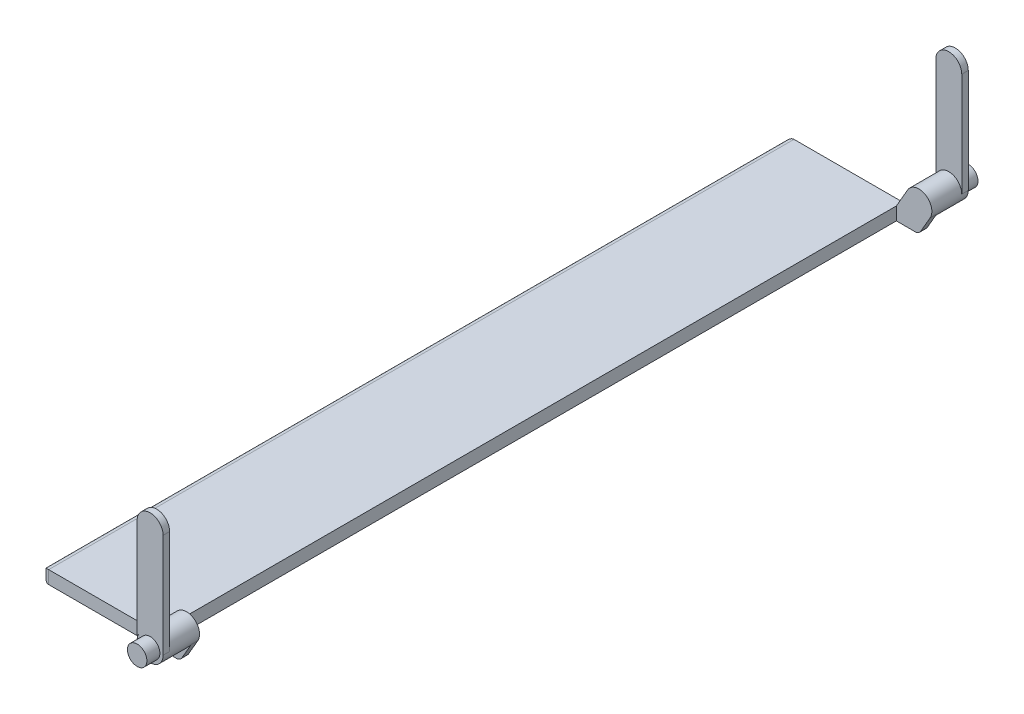
ISO-10303-21;
HEADER;
FILE_DESCRIPTION(('STEP AP214'),'2;1');
FILE_NAME('part.step','',(''),(''),'','','');
FILE_SCHEMA(('AUTOMOTIVE_DESIGN { 1 0 10303 214 1 1 1 1 }'));
ENDSEC;
DATA;
#1=APPLICATION_CONTEXT('core data for automotive mechanical design processes');
#2=APPLICATION_PROTOCOL_DEFINITION('international standard','automotive_design',2000,#1);
#3=PRODUCT_CONTEXT('',#1,'mechanical');
#4=PRODUCT('Part','Part','',(#3));
#5=PRODUCT_RELATED_PRODUCT_CATEGORY('part','',(#4));
#6=PRODUCT_DEFINITION_FORMATION('','',#4);
#7=PRODUCT_DEFINITION_CONTEXT('part definition',#1,'design');
#8=PRODUCT_DEFINITION('design','',#6,#7);
#9=PRODUCT_DEFINITION_SHAPE('','',#8);
#10=(LENGTH_UNIT() NAMED_UNIT(*) SI_UNIT(.MILLI.,.METRE.));
#11=(NAMED_UNIT(*) PLANE_ANGLE_UNIT() SI_UNIT($,.RADIAN.));
#12=(NAMED_UNIT(*) SI_UNIT($,.STERADIAN.) SOLID_ANGLE_UNIT());
#13=UNCERTAINTY_MEASURE_WITH_UNIT(LENGTH_MEASURE(1.E-05),#10,'distance_accuracy_value','');
#14=(GEOMETRIC_REPRESENTATION_CONTEXT(3) GLOBAL_UNCERTAINTY_ASSIGNED_CONTEXT((#13)) GLOBAL_UNIT_ASSIGNED_CONTEXT((#10,
#11,#12)) REPRESENTATION_CONTEXT('',''));
#15=CARTESIAN_POINT('',(0.,0.,0.));
#16=DIRECTION('',(0.,0.,1.));
#17=DIRECTION('',(1.,0.,0.));
#18=AXIS2_PLACEMENT_3D('',#15,#16,#17);
#19=CARTESIAN_POINT('',(0.,0.,91.1098));
#20=DIRECTION('',(0.,0.,-1.));
#21=DIRECTION('',(-1.,0.,0.));
#22=AXIS2_PLACEMENT_3D('',#19,#20,#21);
#23=CYLINDRICAL_SURFACE('',#22,3.175);
#24=DIRECTION('',(0.,0.,-1.));
#25=VECTOR('',#24,1.);
#26=CARTESIAN_POINT('',(-2.7496306570156,1.58749999999999,91.1098));
#27=LINE('',#26,#25);
#28=CARTESIAN_POINT('',(-2.7496306570156,1.5875,-89.5223));
#29=VERTEX_POINT('',#28);
#30=CARTESIAN_POINT('',(-2.7496306570156,1.58749999999999,-91.1098));
#31=VERTEX_POINT('',#30);
#32=EDGE_CURVE('E350',#29,#31,#27,.T.);
#33=ORIENTED_EDGE('',*,*,#32,.F.);
#34=CARTESIAN_POINT('',(0.,0.,-89.5223));
#35=DIRECTION('',(0.,0.,-1.));
#36=DIRECTION('',(-1.,0.,0.));
#37=AXIS2_PLACEMENT_3D('',#34,#35,#36);
#38=CIRCLE('',#37,3.175);
#39=CARTESIAN_POINT('',(2.74963065701558,-1.5875,-89.5223));
#40=VERTEX_POINT('',#39);
#41=EDGE_CURVE('E316',#29,#40,#38,.T.);
#42=ORIENTED_EDGE('',*,*,#41,.T.);
#43=DIRECTION('',(0.,0.,-1.));
#44=VECTOR('',#43,1.);
#45=CARTESIAN_POINT('',(2.74963065701558,-1.5875,91.1098));
#46=LINE('',#45,#44);
#47=CARTESIAN_POINT('',(2.74963065701559,-1.58749999999999,-91.1098));
#48=VERTEX_POINT('',#47);
#49=EDGE_CURVE('E354',#40,#48,#46,.T.);
#50=ORIENTED_EDGE('',*,*,#49,.T.);
#51=CARTESIAN_POINT('',(0.,0.,-91.1098));
#52=DIRECTION('',(0.,0.,1.));
#53=DIRECTION('',(1.,0.,0.));
#54=AXIS2_PLACEMENT_3D('',#51,#52,#53);
#55=CIRCLE('',#54,3.17499999999999);
#56=EDGE_CURVE('E279',#31,#48,#55,.T.);
#57=ORIENTED_EDGE('',*,*,#56,.F.);
#58=EDGE_LOOP('',(#33,#42,#50,#57));
#59=FACE_BOUND('',#58,.T.);
#60=DIRECTION('',(0.,0.,-1.));
#61=VECTOR('',#60,1.);
#62=CARTESIAN_POINT('',(3.17499999999999,0.,-96.8375));
#63=LINE('',#62,#61);
#64=CARTESIAN_POINT('',(3.17499999999999,0.,-96.8375));
#65=VERTEX_POINT('',#64);
#66=CARTESIAN_POINT('',(3.17499999999999,0.,-98.425));
#67=VERTEX_POINT('',#66);
#68=EDGE_CURVE('E58',#65,#67,#63,.T.);
#69=ORIENTED_EDGE('',*,*,#68,.F.);
#70=CARTESIAN_POINT('',(0.,0.,-96.8375));
#71=DIRECTION('',(0.,0.,1.));
#72=DIRECTION('',(-1.,0.,0.));
#73=AXIS2_PLACEMENT_3D('',#70,#71,#72);
#74=CIRCLE('',#73,3.175);
#75=CARTESIAN_POINT('',(-2.7496306570156,1.58749999999999,-96.8375));
#76=VERTEX_POINT('',#75);
#77=EDGE_CURVE('E241',#65,#76,#74,.T.);
#78=ORIENTED_EDGE('',*,*,#77,.T.);
#79=DIRECTION('',(0.,0.,-1.));
#80=VECTOR('',#79,1.);
#81=CARTESIAN_POINT('',(-2.7496306570156,1.58749999999999,-96.8375));
#82=LINE('',#81,#80);
#83=CARTESIAN_POINT('',(-2.7496306570156,1.58749999999999,-98.425));
#84=VERTEX_POINT('',#83);
#85=EDGE_CURVE('E256',#76,#84,#82,.T.);
#86=ORIENTED_EDGE('',*,*,#85,.T.);
#87=CARTESIAN_POINT('',(0.,0.,-98.425));
#88=DIRECTION('',(0.,0.,1.));
#89=DIRECTION('',(1.,0.,0.));
#90=AXIS2_PLACEMENT_3D('',#87,#88,#89);
#91=CIRCLE('',#90,3.17499999999999);
#92=EDGE_CURVE('E280',#84,#67,#91,.T.);
#93=ORIENTED_EDGE('',*,*,#92,.T.);
#94=EDGE_LOOP('',(#69,#78,#86,#93));
#95=FACE_BOUND('',#94,.T.);
#96=ADVANCED_FACE('F35',(#59,#95),#23,.T.);
#97=CARTESIAN_POINT('',(0.,0.,91.1098));
#98=DIRECTION('',(0.,0.,1.));
#99=DIRECTION('',(1.,0.,0.));
#100=AXIS2_PLACEMENT_3D('',#97,#98,#99);
#101=PLANE('',#100);
#102=DIRECTION('',(0.499999999999999,0.866025403784439,0.));
#103=VECTOR('',#102,1.);
#104=CARTESIAN_POINT('',(2.74963065701559,-1.58749999999999,91.1098));
#105=LINE('',#104,#103);
#106=CARTESIAN_POINT('',(0.458271776169257,-5.55625000000001,91.1098));
#107=VERTEX_POINT('',#106);
#108=CARTESIAN_POINT('',(2.74963065701558,-1.5875,91.1098));
#109=VERTEX_POINT('',#108);
#110=EDGE_CURVE('E326',#107,#109,#105,.T.);
#111=ORIENTED_EDGE('',*,*,#110,.T.);
#112=CARTESIAN_POINT('',(0.,0.,91.1098));
#113=DIRECTION('',(0.,0.,1.));
#114=DIRECTION('',(1.,0.,0.));
#115=AXIS2_PLACEMENT_3D('',#112,#113,#114);
#116=CIRCLE('',#115,3.17499999999999);
#117=CARTESIAN_POINT('',(-2.74963065701559,1.58749999999999,91.1098));
#118=VERTEX_POINT('',#117);
#119=EDGE_CURVE('E287',#118,#109,#116,.T.);
#120=ORIENTED_EDGE('',*,*,#119,.F.);
#121=DIRECTION('',(-0.5,-0.866025403784439,0.));
#122=VECTOR('',#121,1.);
#123=CARTESIAN_POINT('',(-2.7496306570156,1.5875,91.1098));
#124=LINE('',#123,#122);
#125=CARTESIAN_POINT('',(-5.49926131402924,-3.17499999999662,91.1098));
#126=VERTEX_POINT('',#125);
#127=EDGE_CURVE('E328',#118,#126,#124,.T.);
#128=ORIENTED_EDGE('',*,*,#127,.T.);
#129=DIRECTION('',(1.,0.,0.));
#130=VECTOR('',#129,1.);
#131=CARTESIAN_POINT('',(0.,-3.17499999999662,91.1098));
#132=LINE('',#131,#130);
#133=CARTESIAN_POINT('',(-32.1183,-3.17499999999663,91.1098));
#134=VERTEX_POINT('',#133);
#135=EDGE_CURVE('E332',#134,#126,#132,.T.);
#136=ORIENTED_EDGE('',*,*,#135,.F.);
#137=DIRECTION('',(0.,1.,0.));
#138=VECTOR('',#137,1.);
#139=CARTESIAN_POINT('',(-32.1183,0.,91.1098));
#140=LINE('',#139,#138);
#141=CARTESIAN_POINT('',(-32.1183,-6.35,91.1098));
#142=VERTEX_POINT('',#141);
#143=EDGE_CURVE('E382',#134,#142,#140,.F.);
#144=ORIENTED_EDGE('',*,*,#143,.T.);
#145=DIRECTION('',(1.,0.,0.));
#146=VECTOR('',#145,1.);
#147=CARTESIAN_POINT('',(0.,-6.35000000000001,91.1098));
#148=LINE('',#147,#146);
#149=CARTESIAN_POINT('',(-0.916543552338539,-6.35000000000001,91.1098));
#150=VERTEX_POINT('',#149);
#151=EDGE_CURVE('E334',#142,#150,#148,.T.);
#152=ORIENTED_EDGE('',*,*,#151,.T.);
#153=CARTESIAN_POINT('',(-0.916543552338539,-4.76250000000001,91.1098));
#154=DIRECTION('',(0.,0.,1.));
#155=DIRECTION('',(1.,0.,0.));
#156=AXIS2_PLACEMENT_3D('',#153,#154,#155);
#157=CIRCLE('',#156,1.5875);
#158=EDGE_CURVE('E385',#150,#107,#157,.T.);
#159=ORIENTED_EDGE('',*,*,#158,.T.);
#160=EDGE_LOOP('',(#111,#120,#128,#136,#144,#152,#159));
#161=FACE_BOUND('',#160,.T.);
#162=ADVANCED_FACE('F442',(#161),#101,.T.);
#163=CARTESIAN_POINT('',(2.74963065701559,-1.58749999999999,91.1098));
#164=DIRECTION('',(-0.866025403784439,0.499999999999999,0.));
#165=DIRECTION('',(-0.499999999999999,-0.866025403784439,0.));
#166=AXIS2_PLACEMENT_3D('',#163,#164,#165);
#167=PLANE('',#166);
#168=ORIENTED_EDGE('',*,*,#110,.F.);
#169=DIRECTION('',(0.,0.,-1.));
#170=VECTOR('',#169,1.);
#171=CARTESIAN_POINT('',(0.458271776169257,-5.55625000000001,91.1098));
#172=LINE('',#171,#170);
#173=CARTESIAN_POINT('',(0.458271776169257,-5.55625000000001,89.5223));
#174=VERTEX_POINT('',#173);
#175=EDGE_CURVE('E377',#107,#174,#172,.T.);
#176=ORIENTED_EDGE('',*,*,#175,.T.);
#177=DIRECTION('',(-0.499999999999999,-0.866025403784439,0.));
#178=VECTOR('',#177,1.);
#179=CARTESIAN_POINT('',(2.74963065701559,-1.58749999999999,89.5223));
#180=LINE('',#179,#178);
#181=CARTESIAN_POINT('',(2.74963065701558,-1.5875,89.5223));
#182=VERTEX_POINT('',#181);
#183=EDGE_CURVE('E310',#182,#174,#180,.T.);
#184=ORIENTED_EDGE('',*,*,#183,.F.);
#185=EDGE_CURVE('E355',#109,#182,#46,.T.);
#186=ORIENTED_EDGE('',*,*,#185,.F.);
#187=EDGE_LOOP('',(#168,#176,#184,#186));
#188=FACE_BOUND('',#187,.T.);
#189=ADVANCED_FACE('F450',(#188),#167,.F.);
#190=CARTESIAN_POINT('',(0.,0.,89.5223));
#191=DIRECTION('',(0.,0.,-1.));
#192=DIRECTION('',(-1.,0.,0.));
#193=AXIS2_PLACEMENT_3D('',#190,#191,#192);
#194=CIRCLE('',#193,3.175);
#195=CARTESIAN_POINT('',(-2.7496306570156,1.5875,89.5223));
#196=VERTEX_POINT('',#195);
#197=EDGE_CURVE('E308',#196,#182,#194,.T.);
#198=ORIENTED_EDGE('',*,*,#197,.F.);
#199=EDGE_CURVE('E351',#118,#196,#27,.T.);
#200=ORIENTED_EDGE('',*,*,#199,.F.);
#201=ORIENTED_EDGE('',*,*,#119,.T.);
#202=ORIENTED_EDGE('',*,*,#185,.T.);
#203=EDGE_LOOP('',(#198,#200,#201,#202));
#204=FACE_BOUND('',#203,.T.);
#205=CARTESIAN_POINT('',(0.,0.,98.425));
#206=DIRECTION('',(0.,0.,1.));
#207=DIRECTION('',(1.,0.,0.));
#208=AXIS2_PLACEMENT_3D('',#205,#206,#207);
#209=CIRCLE('',#208,3.17499999999999);
#210=CARTESIAN_POINT('',(-2.7496306570156,1.5875,98.425));
#211=VERTEX_POINT('',#210);
#212=CARTESIAN_POINT('',(3.17499999999999,0.,98.425));
#213=VERTEX_POINT('',#212);
#214=EDGE_CURVE('E290',#211,#213,#209,.T.);
#215=ORIENTED_EDGE('',*,*,#214,.F.);
#216=DIRECTION('',(0.,0.,1.));
#217=VECTOR('',#216,1.);
#218=CARTESIAN_POINT('',(-2.7496306570156,1.58749999999999,96.8375));
#219=LINE('',#218,#217);
#220=CARTESIAN_POINT('',(-2.7496306570156,1.58749999999999,96.8375));
#221=VERTEX_POINT('',#220);
#222=EDGE_CURVE('E50',#221,#211,#219,.T.);
#223=ORIENTED_EDGE('',*,*,#222,.F.);
#224=CARTESIAN_POINT('',(0.,0.,96.8375));
#225=DIRECTION('',(0.,0.,1.));
#226=DIRECTION('',(-1.,0.,0.));
#227=AXIS2_PLACEMENT_3D('',#224,#225,#226);
#228=CIRCLE('',#227,3.175);
#229=CARTESIAN_POINT('',(3.17499999999999,0.,96.8375));
#230=VERTEX_POINT('',#229);
#231=EDGE_CURVE('E200',#230,#221,#228,.T.);
#232=ORIENTED_EDGE('',*,*,#231,.F.);
#233=DIRECTION('',(0.,0.,1.));
#234=VECTOR('',#233,1.);
#235=CARTESIAN_POINT('',(3.17499999999999,0.,96.8375));
#236=LINE('',#235,#234);
#237=EDGE_CURVE('E208',#230,#213,#236,.T.);
#238=ORIENTED_EDGE('',*,*,#237,.T.);
#239=EDGE_LOOP('',(#215,#223,#232,#238));
#240=FACE_BOUND('',#239,.T.);
#241=ADVANCED_FACE('F218',(#204,#240),#23,.T.);
#242=CARTESIAN_POINT('',(-2.7496306570156,1.5875,91.1098));
#243=DIRECTION('',(0.866025403784439,-0.5,0.));
#244=DIRECTION('',(0.5,0.866025403784439,0.));
#245=AXIS2_PLACEMENT_3D('',#242,#243,#244);
#246=PLANE('',#245);
#247=DIRECTION('',(0.5,0.866025403784439,0.));
#248=VECTOR('',#247,1.);
#249=CARTESIAN_POINT('',(-2.7496306570156,1.5875,89.5223));
#250=LINE('',#249,#248);
#251=CARTESIAN_POINT('',(-5.49926131402924,-3.17499999999662,89.5223));
#252=VERTEX_POINT('',#251);
#253=EDGE_CURVE('E303',#252,#196,#250,.T.);
#254=ORIENTED_EDGE('',*,*,#253,.F.);
#255=DIRECTION('',(0.,0.,-1.));
#256=VECTOR('',#255,1.);
#257=CARTESIAN_POINT('',(-5.49926131402924,-3.17499999999662,91.1098));
#258=LINE('',#257,#256);
#259=EDGE_CURVE('E347',#126,#252,#258,.T.);
#260=ORIENTED_EDGE('',*,*,#259,.F.);
#261=ORIENTED_EDGE('',*,*,#127,.F.);
#262=ORIENTED_EDGE('',*,*,#199,.T.);
#263=EDGE_LOOP('',(#254,#260,#261,#262));
#264=FACE_BOUND('',#263,.T.);
#265=ADVANCED_FACE('F460',(#264),#246,.F.);
#266=DIRECTION('',(-0.499999999999999,-0.866025403784439,0.));
#267=VECTOR('',#266,1.);
#268=CARTESIAN_POINT('',(2.74963065701559,-1.58749999999999,-89.5223));
#269=LINE('',#268,#267);
#270=CARTESIAN_POINT('',(0.458271776169257,-5.55625000000001,-89.5223));
#271=VERTEX_POINT('',#270);
#272=EDGE_CURVE('E319',#40,#271,#269,.T.);
#273=ORIENTED_EDGE('',*,*,#272,.T.);
#274=DIRECTION('',(0.,0.,-1.));
#275=VECTOR('',#274,1.);
#276=CARTESIAN_POINT('',(0.458271776169257,-5.55625000000001,91.1098));
#277=LINE('',#276,#275);
#278=CARTESIAN_POINT('',(0.458271776169257,-5.55625000000001,-91.1098));
#279=VERTEX_POINT('',#278);
#280=EDGE_CURVE('E362',#271,#279,#277,.T.);
#281=ORIENTED_EDGE('',*,*,#280,.T.);
#282=DIRECTION('',(0.499999999999999,0.866025403784439,0.));
#283=VECTOR('',#282,1.);
#284=CARTESIAN_POINT('',(2.74963065701559,-1.58749999999999,-91.1098));
#285=LINE('',#284,#283);
#286=EDGE_CURVE('E325',#279,#48,#285,.T.);
#287=ORIENTED_EDGE('',*,*,#286,.T.);
#288=ORIENTED_EDGE('',*,*,#49,.F.);
#289=EDGE_LOOP('',(#273,#281,#287,#288));
#290=FACE_BOUND('',#289,.T.);
#291=ADVANCED_FACE('F425',(#290),#167,.F.);
#292=CARTESIAN_POINT('',(-5.49926131402924,-3.17499999999662,-89.5223));
#293=VERTEX_POINT('',#292);
#294=CARTESIAN_POINT('',(-5.49926131402924,-3.17499999999662,-91.1098));
#295=VERTEX_POINT('',#294);
#296=EDGE_CURVE('E337',#293,#295,#258,.T.);
#297=ORIENTED_EDGE('',*,*,#296,.F.);
#298=DIRECTION('',(0.5,0.866025403784439,0.));
#299=VECTOR('',#298,1.);
#300=CARTESIAN_POINT('',(-2.7496306570156,1.5875,-89.5223));
#301=LINE('',#300,#299);
#302=EDGE_CURVE('E313',#293,#29,#301,.T.);
#303=ORIENTED_EDGE('',*,*,#302,.T.);
#304=ORIENTED_EDGE('',*,*,#32,.T.);
#305=DIRECTION('',(-0.5,-0.866025403784439,0.));
#306=VECTOR('',#305,1.);
#307=CARTESIAN_POINT('',(-2.7496306570156,1.5875,-91.1098));
#308=LINE('',#307,#306);
#309=EDGE_CURVE('E340',#31,#295,#308,.T.);
#310=ORIENTED_EDGE('',*,*,#309,.T.);
#311=EDGE_LOOP('',(#297,#303,#304,#310));
#312=FACE_BOUND('',#311,.T.);
#313=ADVANCED_FACE('F418',(#312),#246,.F.);
#314=CARTESIAN_POINT('',(0.,-3.17499999999662,91.1098));
#315=DIRECTION('',(0.,1.,0.));
#316=DIRECTION('',(-1.,0.,0.));
#317=AXIS2_PLACEMENT_3D('',#314,#315,#316);
#318=PLANE('',#317);
#319=DIRECTION('',(1.,0.,0.));
#320=VECTOR('',#319,1.);
#321=CARTESIAN_POINT('',(0.,-3.17499999999662,-91.1098));
#322=LINE('',#321,#320);
#323=CARTESIAN_POINT('',(-32.1183,-3.17499999999663,-91.1098));
#324=VERTEX_POINT('',#323);
#325=EDGE_CURVE('E343',#324,#295,#322,.T.);
#326=ORIENTED_EDGE('',*,*,#325,.F.);
#327=DIRECTION('',(0.,0.,-1.));
#328=VECTOR('',#327,1.);
#329=CARTESIAN_POINT('',(-32.1183,-3.17499999999663,91.1098));
#330=LINE('',#329,#328);
#331=EDGE_CURVE('E43',#324,#134,#330,.F.);
#332=ORIENTED_EDGE('',*,*,#331,.T.);
#333=ORIENTED_EDGE('',*,*,#135,.T.);
#334=ORIENTED_EDGE('',*,*,#259,.T.);
#335=DIRECTION('',(0.,0.,-1.));
#336=VECTOR('',#335,1.);
#337=CARTESIAN_POINT('',(-5.49926131402924,-3.17499999999662,91.1098));
#338=LINE('',#337,#336);
#339=EDGE_CURVE('E322',#252,#293,#338,.T.);
#340=ORIENTED_EDGE('',*,*,#339,.T.);
#341=ORIENTED_EDGE('',*,*,#296,.T.);
#342=EDGE_LOOP('',(#326,#332,#333,#334,#340,#341));
#343=FACE_BOUND('',#342,.T.);
#344=ADVANCED_FACE('F413',(#343),#318,.T.);
#345=CARTESIAN_POINT('',(0.,-6.35000000000001,91.1098));
#346=DIRECTION('',(0.,1.,0.));
#347=DIRECTION('',(-1.,0.,0.));
#348=AXIS2_PLACEMENT_3D('',#345,#346,#347);
#349=PLANE('',#348);
#350=DIRECTION('',(1.,0.,0.));
#351=VECTOR('',#350,1.);
#352=CARTESIAN_POINT('',(0.,-6.35000000000001,-91.1098));
#353=LINE('',#352,#351);
#354=CARTESIAN_POINT('',(-32.1183,-6.35,-91.1098));
#355=VERTEX_POINT('',#354);
#356=CARTESIAN_POINT('',(-0.916543552338539,-6.35000000000001,-91.1098));
#357=VERTEX_POINT('',#356);
#358=EDGE_CURVE('E329',#355,#357,#353,.T.);
#359=ORIENTED_EDGE('',*,*,#358,.T.);
#360=DIRECTION('',(0.,0.,-1.));
#361=VECTOR('',#360,1.);
#362=CARTESIAN_POINT('',(-0.916543552338539,-6.35000000000001,91.1098));
#363=LINE('',#362,#361);
#364=CARTESIAN_POINT('',(-0.916543552338539,-6.35000000000001,-89.5223));
#365=VERTEX_POINT('',#364);
#366=EDGE_CURVE('E373',#357,#365,#363,.F.);
#367=ORIENTED_EDGE('',*,*,#366,.T.);
#368=DIRECTION('',(-1.,0.,0.));
#369=VECTOR('',#368,1.);
#370=CARTESIAN_POINT('',(0.,-6.35000000000001,-89.5223));
#371=LINE('',#370,#369);
#372=CARTESIAN_POINT('',(-5.49926131402924,-6.35000000000001,-89.5223));
#373=VERTEX_POINT('',#372);
#374=EDGE_CURVE('E360',#365,#373,#371,.T.);
#375=ORIENTED_EDGE('',*,*,#374,.T.);
#376=DIRECTION('',(0.,0.,-1.));
#377=VECTOR('',#376,1.);
#378=CARTESIAN_POINT('',(-5.49926131402924,-6.35000000000001,0.));
#379=LINE('',#378,#377);
#380=CARTESIAN_POINT('',(-5.49926131402924,-6.35000000000001,89.5223));
#381=VERTEX_POINT('',#380);
#382=EDGE_CURVE('E295',#381,#373,#379,.T.);
#383=ORIENTED_EDGE('',*,*,#382,.F.);
#384=DIRECTION('',(-1.,0.,0.));
#385=VECTOR('',#384,1.);
#386=CARTESIAN_POINT('',(0.,-6.35000000000001,89.5223));
#387=LINE('',#386,#385);
#388=CARTESIAN_POINT('',(-0.916543552338539,-6.35000000000001,89.5223));
#389=VERTEX_POINT('',#388);
#390=EDGE_CURVE('E358',#389,#381,#387,.T.);
#391=ORIENTED_EDGE('',*,*,#390,.F.);
#392=DIRECTION('',(0.,0.,-1.));
#393=VECTOR('',#392,1.);
#394=CARTESIAN_POINT('',(-0.916543552338539,-6.35000000000001,91.1098));
#395=LINE('',#394,#393);
#396=EDGE_CURVE('E371',#389,#150,#395,.F.);
#397=ORIENTED_EDGE('',*,*,#396,.T.);
#398=ORIENTED_EDGE('',*,*,#151,.F.);
#399=DIRECTION('',(0.,0.,-1.));
#400=VECTOR('',#399,1.);
#401=CARTESIAN_POINT('',(-32.1183,-6.35,-91.1098));
#402=LINE('',#401,#400);
#403=EDGE_CURVE('E369',#142,#355,#402,.T.);
#404=ORIENTED_EDGE('',*,*,#403,.T.);
#405=EDGE_LOOP('',(#359,#367,#375,#383,#391,#397,#398,#404));
#406=FACE_BOUND('',#405,.T.);
#407=ADVANCED_FACE('F436',(#406),#349,.F.);
#408=CARTESIAN_POINT('',(0.,0.,-91.1098));
#409=DIRECTION('',(0.,0.,1.));
#410=DIRECTION('',(1.,0.,0.));
#411=AXIS2_PLACEMENT_3D('',#408,#409,#410);
#412=PLANE('',#411);
#413=ORIENTED_EDGE('',*,*,#309,.F.);
#414=ORIENTED_EDGE('',*,*,#56,.T.);
#415=ORIENTED_EDGE('',*,*,#286,.F.);
#416=CARTESIAN_POINT('',(-0.916543552338539,-4.76250000000001,-91.1098));
#417=DIRECTION('',(0.,0.,1.));
#418=DIRECTION('',(1.,0.,0.));
#419=AXIS2_PLACEMENT_3D('',#416,#417,#418);
#420=CIRCLE('',#419,1.5875);
#421=EDGE_CURVE('E367',#279,#357,#420,.F.);
#422=ORIENTED_EDGE('',*,*,#421,.T.);
#423=ORIENTED_EDGE('',*,*,#358,.F.);
#424=DIRECTION('',(0.,1.,0.));
#425=VECTOR('',#424,1.);
#426=CARTESIAN_POINT('',(-32.1183,-3.17499999999663,-91.1098));
#427=LINE('',#426,#425);
#428=EDGE_CURVE('E365',#355,#324,#427,.T.);
#429=ORIENTED_EDGE('',*,*,#428,.T.);
#430=ORIENTED_EDGE('',*,*,#325,.T.);
#431=EDGE_LOOP('',(#413,#414,#415,#422,#423,#429,#430));
#432=FACE_BOUND('',#431,.T.);
#433=ADVANCED_FACE('F410',(#432),#412,.F.);
#434=CARTESIAN_POINT('',(0.,-6.35000000000001,-89.5223));
#435=DIRECTION('',(0.,0.,-1.));
#436=DIRECTION('',(-1.,0.,0.));
#437=AXIS2_PLACEMENT_3D('',#434,#435,#436);
#438=PLANE('',#437);
#439=ORIENTED_EDGE('',*,*,#374,.F.);
#440=CARTESIAN_POINT('',(-0.916543552338539,-4.76250000000001,-89.5223));
#441=DIRECTION('',(0.,0.,-1.));
#442=DIRECTION('',(-1.,0.,0.));
#443=AXIS2_PLACEMENT_3D('',#440,#441,#442);
#444=CIRCLE('',#443,1.5875);
#445=EDGE_CURVE('E375',#365,#271,#444,.F.);
#446=ORIENTED_EDGE('',*,*,#445,.T.);
#447=ORIENTED_EDGE('',*,*,#272,.F.);
#448=ORIENTED_EDGE('',*,*,#41,.F.);
#449=ORIENTED_EDGE('',*,*,#302,.F.);
#450=DIRECTION('',(0.,1.,0.));
#451=VECTOR('',#450,1.);
#452=CARTESIAN_POINT('',(-5.49926131402924,-6.35000000000001,-89.5223));
#453=LINE('',#452,#451);
#454=EDGE_CURVE('E300',#373,#293,#453,.T.);
#455=ORIENTED_EDGE('',*,*,#454,.F.);
#456=EDGE_LOOP('',(#439,#446,#447,#448,#449,#455));
#457=FACE_BOUND('',#456,.T.);
#458=ADVANCED_FACE('F429',(#457),#438,.F.);
#459=CARTESIAN_POINT('',(0.,-6.35000000000001,89.5223));
#460=DIRECTION('',(0.,0.,-1.));
#461=DIRECTION('',(-1.,0.,0.));
#462=AXIS2_PLACEMENT_3D('',#459,#460,#461);
#463=PLANE('',#462);
#464=ORIENTED_EDGE('',*,*,#183,.T.);
#465=CARTESIAN_POINT('',(-0.916543552338539,-4.76250000000001,89.5223));
#466=DIRECTION('',(0.,0.,-1.));
#467=DIRECTION('',(-1.,0.,0.));
#468=AXIS2_PLACEMENT_3D('',#465,#466,#467);
#469=CIRCLE('',#468,1.5875);
#470=EDGE_CURVE('E380',#174,#389,#469,.T.);
#471=ORIENTED_EDGE('',*,*,#470,.T.);
#472=ORIENTED_EDGE('',*,*,#390,.T.);
#473=DIRECTION('',(0.,1.,0.));
#474=VECTOR('',#473,1.);
#475=CARTESIAN_POINT('',(-5.49926131402924,-6.35000000000001,89.5223));
#476=LINE('',#475,#474);
#477=EDGE_CURVE('E298',#381,#252,#476,.T.);
#478=ORIENTED_EDGE('',*,*,#477,.T.);
#479=ORIENTED_EDGE('',*,*,#253,.T.);
#480=ORIENTED_EDGE('',*,*,#197,.T.);
#481=EDGE_LOOP('',(#464,#471,#472,#478,#479,#480));
#482=FACE_BOUND('',#481,.T.);
#483=ADVANCED_FACE('F453',(#482),#463,.T.);
#484=CARTESIAN_POINT('',(-5.49926131402924,-6.35000000000001,0.));
#485=DIRECTION('',(1.,0.,0.));
#486=DIRECTION('',(0.,0.,-1.));
#487=AXIS2_PLACEMENT_3D('',#484,#485,#486);
#488=PLANE('',#487);
#489=ORIENTED_EDGE('',*,*,#477,.F.);
#490=ORIENTED_EDGE('',*,*,#382,.T.);
#491=ORIENTED_EDGE('',*,*,#454,.T.);
#492=ORIENTED_EDGE('',*,*,#339,.F.);
#493=EDGE_LOOP('',(#489,#490,#491,#492));
#494=FACE_BOUND('',#493,.T.);
#495=ADVANCED_FACE('F479',(#494),#488,.T.);
#496=CARTESIAN_POINT('',(-0.916543552338539,-4.76250000000001,91.1098));
#497=DIRECTION('',(0.,0.,-1.));
#498=DIRECTION('',(-1.,0.,0.));
#499=AXIS2_PLACEMENT_3D('',#496,#497,#498);
#500=CYLINDRICAL_SURFACE('',#499,1.5875);
#501=ORIENTED_EDGE('',*,*,#445,.F.);
#502=ORIENTED_EDGE('',*,*,#366,.F.);
#503=ORIENTED_EDGE('',*,*,#421,.F.);
#504=ORIENTED_EDGE('',*,*,#280,.F.);
#505=EDGE_LOOP('',(#501,#502,#503,#504));
#506=FACE_BOUND('',#505,.T.);
#507=ADVANCED_FACE('F433',(#506),#500,.T.);
#508=CARTESIAN_POINT('',(-0.916543552338539,-4.76250000000001,91.1098));
#509=DIRECTION('',(0.,0.,-1.));
#510=DIRECTION('',(-1.,0.,0.));
#511=AXIS2_PLACEMENT_3D('',#508,#509,#510);
#512=CYLINDRICAL_SURFACE('',#511,1.5875);
#513=ORIENTED_EDGE('',*,*,#158,.F.);
#514=ORIENTED_EDGE('',*,*,#396,.F.);
#515=ORIENTED_EDGE('',*,*,#470,.F.);
#516=ORIENTED_EDGE('',*,*,#175,.F.);
#517=EDGE_LOOP('',(#513,#514,#515,#516));
#518=FACE_BOUND('',#517,.T.);
#519=ADVANCED_FACE('F447',(#518),#512,.T.);
#520=CARTESIAN_POINT('',(-32.1183,0.,-89.5223));
#521=DIRECTION('',(0.,-1.,0.));
#522=DIRECTION('',(0.,0.,-1.));
#523=AXIS2_PLACEMENT_3D('',#520,#521,#522);
#524=CYLINDRICAL_SURFACE('',#523,1.5875);
#525=CARTESIAN_POINT('',(-32.1183,-4.76249999999663,-89.5223));
#526=DIRECTION('',(0.,-0.707106781186547,-0.707106781186547));
#527=DIRECTION('',(0.,-0.707106781186547,0.707106781186547));
#528=AXIS2_PLACEMENT_3D('',#525,#526,#527);
#529=ELLIPSE('',#528,2.24506403026729,1.5875);
#530=CARTESIAN_POINT('',(-33.7058,-4.76249999999663,-89.5223));
#531=VERTEX_POINT('',#530);
#532=EDGE_CURVE('E392',#324,#531,#529,.F.);
#533=ORIENTED_EDGE('',*,*,#532,.F.);
#534=ORIENTED_EDGE('',*,*,#428,.F.);
#535=CARTESIAN_POINT('',(-32.1183,-4.76250000000001,-89.5223));
#536=DIRECTION('',(0.,-0.707106781186547,0.707106781186547));
#537=DIRECTION('',(0.,-0.707106781186547,-0.707106781186547));
#538=AXIS2_PLACEMENT_3D('',#535,#536,#537);
#539=ELLIPSE('',#538,2.24506403026729,1.5875);
#540=EDGE_CURVE('E299',#531,#355,#539,.T.);
#541=ORIENTED_EDGE('',*,*,#540,.F.);
#542=EDGE_LOOP('',(#533,#534,#541));
#543=FACE_BOUND('',#542,.T.);
#544=ADVANCED_FACE('F37',(#543),#524,.T.);
#545=CARTESIAN_POINT('',(-32.1183,-4.76250000000001,91.1098));
#546=DIRECTION('',(0.,0.,1.));
#547=DIRECTION('',(1.,0.,0.));
#548=AXIS2_PLACEMENT_3D('',#545,#546,#547);
#549=CYLINDRICAL_SURFACE('',#548,1.5875);
#550=DIRECTION('',(0.,0.,-1.));
#551=VECTOR('',#550,1.);
#552=CARTESIAN_POINT('',(-33.7058,-4.76250000000001,91.1098));
#553=LINE('',#552,#551);
#554=CARTESIAN_POINT('',(-33.7058,-4.76249999999663,89.5223));
#555=VERTEX_POINT('',#554);
#556=EDGE_CURVE('E395',#531,#555,#553,.F.);
#557=ORIENTED_EDGE('',*,*,#556,.F.);
#558=ORIENTED_EDGE('',*,*,#540,.T.);
#559=ORIENTED_EDGE('',*,*,#403,.F.);
#560=CARTESIAN_POINT('',(-32.1183,-4.76250000000001,89.5223));
#561=DIRECTION('',(0.,0.707106781186547,0.707106781186547));
#562=DIRECTION('',(0.,-0.707106781186547,0.707106781186547));
#563=AXIS2_PLACEMENT_3D('',#560,#561,#562);
#564=ELLIPSE('',#563,2.24506403026729,1.5875);
#565=EDGE_CURVE('E390',#555,#142,#564,.T.);
#566=ORIENTED_EDGE('',*,*,#565,.F.);
#567=EDGE_LOOP('',(#557,#558,#559,#566));
#568=FACE_BOUND('',#567,.T.);
#569=ADVANCED_FACE('F400',(#568),#549,.T.);
#570=CARTESIAN_POINT('',(-32.1183,-4.76249999999663,91.1098));
#571=DIRECTION('',(0.,0.,-1.));
#572=DIRECTION('',(-1.,0.,0.));
#573=AXIS2_PLACEMENT_3D('',#570,#571,#572);
#574=CYLINDRICAL_SURFACE('',#573,1.5875);
#575=ORIENTED_EDGE('',*,*,#532,.T.);
#576=ORIENTED_EDGE('',*,*,#556,.T.);
#577=CARTESIAN_POINT('',(-32.1183,-4.76249999999663,89.5223));
#578=DIRECTION('',(0.,0.707106781186547,-0.707106781186547));
#579=DIRECTION('',(0.,-0.707106781186547,-0.707106781186547));
#580=AXIS2_PLACEMENT_3D('',#577,#578,#579);
#581=ELLIPSE('',#580,2.24506403026729,1.5875);
#582=EDGE_CURVE('E292',#134,#555,#581,.F.);
#583=ORIENTED_EDGE('',*,*,#582,.F.);
#584=ORIENTED_EDGE('',*,*,#331,.F.);
#585=EDGE_LOOP('',(#575,#576,#583,#584));
#586=FACE_BOUND('',#585,.T.);
#587=ADVANCED_FACE('F486',(#586),#574,.T.);
#588=CARTESIAN_POINT('',(-32.1183,0.,89.5223));
#589=DIRECTION('',(0.,1.,0.));
#590=DIRECTION('',(0.,0.,1.));
#591=AXIS2_PLACEMENT_3D('',#588,#589,#590);
#592=CYLINDRICAL_SURFACE('',#591,1.5875);
#593=ORIENTED_EDGE('',*,*,#565,.T.);
#594=ORIENTED_EDGE('',*,*,#143,.F.);
#595=ORIENTED_EDGE('',*,*,#582,.T.);
#596=EDGE_LOOP('',(#593,#594,#595));
#597=FACE_BOUND('',#596,.T.);
#598=ADVANCED_FACE('F482',(#597),#592,.T.);
#599=CARTESIAN_POINT('',(0.,0.,98.425));
#600=DIRECTION('',(0.,0.,1.));
#601=DIRECTION('',(1.,0.,0.));
#602=AXIS2_PLACEMENT_3D('',#599,#600,#601);
#603=PLANE('',#602);
#604=CARTESIAN_POINT('',(0.,0.,98.425));
#605=DIRECTION('',(0.,0.,1.));
#606=DIRECTION('',(1.,0.,0.));
#607=AXIS2_PLACEMENT_3D('',#604,#605,#606);
#608=CIRCLE('',#607,2.38125);
#609=CARTESIAN_POINT('',(2.38125,0.,98.425));
#610=VERTEX_POINT('',#609);
#611=EDGE_CURVE('E282',#610,#610,#608,.T.);
#612=ORIENTED_EDGE('',*,*,#611,.F.);
#613=EDGE_LOOP('',(#612));
#614=FACE_BOUND('',#613,.T.);
#615=ORIENTED_EDGE('',*,*,#214,.T.);
#616=DIRECTION('',(0.,-1.,0.));
#617=VECTOR('',#616,1.);
#618=CARTESIAN_POINT('',(3.17499999999999,25.4,98.425));
#619=LINE('',#618,#617);
#620=CARTESIAN_POINT('',(3.175,25.4,98.425));
#621=VERTEX_POINT('',#620);
#622=EDGE_CURVE('E211',#621,#213,#619,.T.);
#623=ORIENTED_EDGE('',*,*,#622,.F.);
#624=CARTESIAN_POINT('',(0.,25.4,98.425));
#625=DIRECTION('',(0.,0.,-1.));
#626=DIRECTION('',(-1.,0.,0.));
#627=AXIS2_PLACEMENT_3D('',#624,#625,#626);
#628=CIRCLE('',#627,3.175);
#629=CARTESIAN_POINT('',(-3.175,25.4,98.425));
#630=VERTEX_POINT('',#629);
#631=EDGE_CURVE('E229',#630,#621,#628,.T.);
#632=ORIENTED_EDGE('',*,*,#631,.F.);
#633=DIRECTION('',(0.,1.,0.));
#634=VECTOR('',#633,1.);
#635=CARTESIAN_POINT('',(-3.175,25.4,98.425));
#636=LINE('',#635,#634);
#637=CARTESIAN_POINT('',(-3.175,0.850738685968817,98.425));
#638=VERTEX_POINT('',#637);
#639=EDGE_CURVE('E221',#638,#630,#636,.T.);
#640=ORIENTED_EDGE('',*,*,#639,.F.);
#641=DIRECTION('',(-0.499999999999999,-0.866025403784439,0.));
#642=VECTOR('',#641,1.);
#643=CARTESIAN_POINT('',(-2.7496306570156,1.58749999999999,98.425));
#644=LINE('',#643,#642);
#645=EDGE_CURVE('E219',#211,#638,#644,.T.);
#646=ORIENTED_EDGE('',*,*,#645,.F.);
#647=EDGE_LOOP('',(#615,#623,#632,#640,#646));
#648=FACE_BOUND('',#647,.T.);
#649=ADVANCED_FACE('F485',(#614,#648),#603,.T.);
#650=CARTESIAN_POINT('',(0.,0.,101.6));
#651=DIRECTION('',(0.,0.,-1.));
#652=DIRECTION('',(-1.,0.,0.));
#653=AXIS2_PLACEMENT_3D('',#650,#651,#652);
#654=CYLINDRICAL_SURFACE('',#653,2.38125);
#655=CARTESIAN_POINT('',(0.,0.,101.6));
#656=DIRECTION('',(0.,0.,1.));
#657=DIRECTION('',(1.,0.,0.));
#658=AXIS2_PLACEMENT_3D('',#655,#656,#657);
#659=CIRCLE('',#658,2.38125);
#660=CARTESIAN_POINT('',(2.38125,0.,101.6));
#661=VERTEX_POINT('',#660);
#662=EDGE_CURVE('E284',#661,#661,#659,.T.);
#663=ORIENTED_EDGE('',*,*,#662,.F.);
#664=EDGE_LOOP('',(#663));
#665=FACE_BOUND('',#664,.T.);
#666=ORIENTED_EDGE('',*,*,#611,.T.);
#667=EDGE_LOOP('',(#666));
#668=FACE_BOUND('',#667,.T.);
#669=ADVANCED_FACE('F560',(#665,#668),#654,.T.);
#670=CARTESIAN_POINT('',(0.,0.,101.6));
#671=DIRECTION('',(0.,0.,1.));
#672=DIRECTION('',(1.,0.,0.));
#673=AXIS2_PLACEMENT_3D('',#670,#671,#672);
#674=PLANE('',#673);
#675=ORIENTED_EDGE('',*,*,#662,.T.);
#676=EDGE_LOOP('',(#675));
#677=FACE_BOUND('',#676,.T.);
#678=ADVANCED_FACE('F554',(#677),#674,.T.);
#679=CARTESIAN_POINT('',(0.,0.,-98.425));
#680=DIRECTION('',(0.,0.,-1.));
#681=DIRECTION('',(1.,0.,0.));
#682=AXIS2_PLACEMENT_3D('',#679,#680,#681);
#683=PLANE('',#682);
#684=CARTESIAN_POINT('',(0.,0.,-98.425));
#685=DIRECTION('',(0.,0.,-1.));
#686=DIRECTION('',(-1.,0.,0.));
#687=AXIS2_PLACEMENT_3D('',#684,#685,#686);
#688=CIRCLE('',#687,2.38125);
#689=CARTESIAN_POINT('',(-2.38125,0.,-98.425));
#690=VERTEX_POINT('',#689);
#691=EDGE_CURVE('E11',#690,#690,#688,.T.);
#692=ORIENTED_EDGE('',*,*,#691,.F.);
#693=EDGE_LOOP('',(#692));
#694=FACE_BOUND('',#693,.T.);
#695=ORIENTED_EDGE('',*,*,#92,.F.);
#696=DIRECTION('',(-0.499999999999999,-0.866025403784439,0.));
#697=VECTOR('',#696,1.);
#698=CARTESIAN_POINT('',(-2.7496306570156,1.58749999999999,-98.425));
#699=LINE('',#698,#697);
#700=CARTESIAN_POINT('',(-3.175,0.850738685968817,-98.425));
#701=VERTEX_POINT('',#700);
#702=EDGE_CURVE('E233',#84,#701,#699,.T.);
#703=ORIENTED_EDGE('',*,*,#702,.T.);
#704=DIRECTION('',(0.,1.,0.));
#705=VECTOR('',#704,1.);
#706=CARTESIAN_POINT('',(-3.175,25.4,-98.425));
#707=LINE('',#706,#705);
#708=CARTESIAN_POINT('',(-3.175,25.4,-98.425));
#709=VERTEX_POINT('',#708);
#710=EDGE_CURVE('E259',#701,#709,#707,.T.);
#711=ORIENTED_EDGE('',*,*,#710,.T.);
#712=CARTESIAN_POINT('',(0.,25.4,-98.425));
#713=DIRECTION('',(0.,0.,-1.));
#714=DIRECTION('',(-1.,0.,0.));
#715=AXIS2_PLACEMENT_3D('',#712,#713,#714);
#716=CIRCLE('',#715,3.175);
#717=CARTESIAN_POINT('',(3.175,25.4,-98.425));
#718=VERTEX_POINT('',#717);
#719=EDGE_CURVE('E262',#709,#718,#716,.T.);
#720=ORIENTED_EDGE('',*,*,#719,.T.);
#721=DIRECTION('',(0.,-1.,0.));
#722=VECTOR('',#721,1.);
#723=CARTESIAN_POINT('',(3.17499999999999,25.4,-98.425));
#724=LINE('',#723,#722);
#725=EDGE_CURVE('E244',#718,#67,#724,.T.);
#726=ORIENTED_EDGE('',*,*,#725,.T.);
#727=EDGE_LOOP('',(#695,#703,#711,#720,#726));
#728=FACE_BOUND('',#727,.T.);
#729=ADVANCED_FACE('F559',(#694,#728),#683,.T.);
#730=CARTESIAN_POINT('',(0.,0.,-101.6));
#731=DIRECTION('',(0.,0.,1.));
#732=DIRECTION('',(1.,0.,0.));
#733=AXIS2_PLACEMENT_3D('',#730,#731,#732);
#734=CYLINDRICAL_SURFACE('',#733,2.38125);
#735=CARTESIAN_POINT('',(0.,0.,-101.6));
#736=DIRECTION('',(0.,0.,1.));
#737=DIRECTION('',(1.,0.,0.));
#738=AXIS2_PLACEMENT_3D('',#735,#736,#737);
#739=CIRCLE('',#738,2.38125);
#740=CARTESIAN_POINT('',(2.38125,0.,-101.6));
#741=VERTEX_POINT('',#740);
#742=EDGE_CURVE('E268',#741,#741,#739,.T.);
#743=ORIENTED_EDGE('',*,*,#742,.T.);
#744=EDGE_LOOP('',(#743));
#745=FACE_BOUND('',#744,.T.);
#746=ORIENTED_EDGE('',*,*,#691,.T.);
#747=EDGE_LOOP('',(#746));
#748=FACE_BOUND('',#747,.T.);
#749=ADVANCED_FACE('F703',(#745,#748),#734,.T.);
#750=CARTESIAN_POINT('',(0.,0.,-101.6));
#751=DIRECTION('',(0.,0.,-1.));
#752=DIRECTION('',(1.,0.,0.));
#753=AXIS2_PLACEMENT_3D('',#750,#751,#752);
#754=PLANE('',#753);
#755=ORIENTED_EDGE('',*,*,#742,.F.);
#756=EDGE_LOOP('',(#755));
#757=FACE_BOUND('',#756,.T.);
#758=ADVANCED_FACE('F689',(#757),#754,.T.);
#759=CARTESIAN_POINT('',(3.17499999999999,25.4,-96.8375));
#760=DIRECTION('',(1.,0.,0.));
#761=DIRECTION('',(0.,1.,0.));
#762=AXIS2_PLACEMENT_3D('',#759,#760,#761);
#763=PLANE('',#762);
#764=ORIENTED_EDGE('',*,*,#725,.F.);
#765=DIRECTION('',(0.,0.,-1.));
#766=VECTOR('',#765,1.);
#767=CARTESIAN_POINT('',(3.175,25.4,-96.8375));
#768=LINE('',#767,#766);
#769=CARTESIAN_POINT('',(3.175,25.4,-96.8375));
#770=VERTEX_POINT('',#769);
#771=EDGE_CURVE('E269',#770,#718,#768,.T.);
#772=ORIENTED_EDGE('',*,*,#771,.F.);
#773=DIRECTION('',(0.,-1.,0.));
#774=VECTOR('',#773,1.);
#775=CARTESIAN_POINT('',(3.17499999999999,25.4,-96.8375));
#776=LINE('',#775,#774);
#777=EDGE_CURVE('E253',#770,#65,#776,.T.);
#778=ORIENTED_EDGE('',*,*,#777,.T.);
#779=ORIENTED_EDGE('',*,*,#68,.T.);
#780=EDGE_LOOP('',(#764,#772,#778,#779));
#781=FACE_BOUND('',#780,.T.);
#782=ADVANCED_FACE('F685',(#781),#763,.T.);
#783=CARTESIAN_POINT('',(0.,25.4,-96.8375));
#784=DIRECTION('',(0.,0.,-1.));
#785=DIRECTION('',(-1.,0.,0.));
#786=AXIS2_PLACEMENT_3D('',#783,#784,#785);
#787=CYLINDRICAL_SURFACE('',#786,3.175);
#788=ORIENTED_EDGE('',*,*,#719,.F.);
#789=DIRECTION('',(0.,0.,-1.));
#790=VECTOR('',#789,1.);
#791=CARTESIAN_POINT('',(-3.175,25.4,-96.8375));
#792=LINE('',#791,#790);
#793=CARTESIAN_POINT('',(-3.175,25.4,-96.8375));
#794=VERTEX_POINT('',#793);
#795=EDGE_CURVE('E271',#794,#709,#792,.T.);
#796=ORIENTED_EDGE('',*,*,#795,.F.);
#797=CARTESIAN_POINT('',(0.,25.4,-96.8375));
#798=DIRECTION('',(0.,0.,-1.));
#799=DIRECTION('',(-1.,0.,0.));
#800=AXIS2_PLACEMENT_3D('',#797,#798,#799);
#801=CIRCLE('',#800,3.175);
#802=EDGE_CURVE('E250',#794,#770,#801,.T.);
#803=ORIENTED_EDGE('',*,*,#802,.T.);
#804=ORIENTED_EDGE('',*,*,#771,.T.);
#805=EDGE_LOOP('',(#788,#796,#803,#804));
#806=FACE_BOUND('',#805,.T.);
#807=ADVANCED_FACE('F688',(#806),#787,.T.);
#808=CARTESIAN_POINT('',(-3.175,25.4,-96.8375));
#809=DIRECTION('',(-1.,0.,0.));
#810=DIRECTION('',(0.,-1.,0.));
#811=AXIS2_PLACEMENT_3D('',#808,#809,#810);
#812=PLANE('',#811);
#813=ORIENTED_EDGE('',*,*,#710,.F.);
#814=DIRECTION('',(0.,0.,-1.));
#815=VECTOR('',#814,1.);
#816=CARTESIAN_POINT('',(-3.175,0.850738685968817,-96.8375));
#817=LINE('',#816,#815);
#818=CARTESIAN_POINT('',(-3.175,0.850738685968817,-96.8375));
#819=VERTEX_POINT('',#818);
#820=EDGE_CURVE('E273',#819,#701,#817,.T.);
#821=ORIENTED_EDGE('',*,*,#820,.F.);
#822=DIRECTION('',(0.,1.,0.));
#823=VECTOR('',#822,1.);
#824=CARTESIAN_POINT('',(-3.175,25.4,-96.8375));
#825=LINE('',#824,#823);
#826=EDGE_CURVE('E247',#819,#794,#825,.T.);
#827=ORIENTED_EDGE('',*,*,#826,.T.);
#828=ORIENTED_EDGE('',*,*,#795,.T.);
#829=EDGE_LOOP('',(#813,#821,#827,#828));
#830=FACE_BOUND('',#829,.T.);
#831=ADVANCED_FACE('F693',(#830),#812,.T.);
#832=CARTESIAN_POINT('',(-2.7496306570156,1.58749999999999,-96.8375));
#833=DIRECTION('',(0.866025403784439,-0.499999999999999,0.));
#834=DIRECTION('',(0.499999999999999,0.866025403784439,0.));
#835=AXIS2_PLACEMENT_3D('',#832,#833,#834);
#836=PLANE('',#835);
#837=ORIENTED_EDGE('',*,*,#702,.F.);
#838=ORIENTED_EDGE('',*,*,#85,.F.);
#839=DIRECTION('',(-0.499999999999999,-0.866025403784439,0.));
#840=VECTOR('',#839,1.);
#841=CARTESIAN_POINT('',(-2.7496306570156,1.58749999999999,-96.8375));
#842=LINE('',#841,#840);
#843=EDGE_CURVE('E243',#76,#819,#842,.T.);
#844=ORIENTED_EDGE('',*,*,#843,.T.);
#845=ORIENTED_EDGE('',*,*,#820,.T.);
#846=EDGE_LOOP('',(#837,#838,#844,#845));
#847=FACE_BOUND('',#846,.T.);
#848=ADVANCED_FACE('F683',(#847),#836,.T.);
#849=CARTESIAN_POINT('',(0.,0.,-96.8375));
#850=DIRECTION('',(0.,0.,-1.));
#851=DIRECTION('',(-1.,0.,0.));
#852=AXIS2_PLACEMENT_3D('',#849,#850,#851);
#853=PLANE('',#852);
#854=ORIENTED_EDGE('',*,*,#77,.F.);
#855=ORIENTED_EDGE('',*,*,#777,.F.);
#856=ORIENTED_EDGE('',*,*,#802,.F.);
#857=ORIENTED_EDGE('',*,*,#826,.F.);
#858=ORIENTED_EDGE('',*,*,#843,.F.);
#859=EDGE_LOOP('',(#854,#855,#856,#857,#858));
#860=FACE_BOUND('',#859,.T.);
#861=ADVANCED_FACE('F641',(#860),#853,.F.);
#862=CARTESIAN_POINT('',(-2.7496306570156,1.58749999999999,96.8375));
#863=DIRECTION('',(-0.866025403784439,0.499999999999999,0.));
#864=DIRECTION('',(-0.499999999999999,-0.866025403784439,0.));
#865=AXIS2_PLACEMENT_3D('',#862,#863,#864);
#866=PLANE('',#865);
#867=ORIENTED_EDGE('',*,*,#645,.T.);
#868=DIRECTION('',(0.,0.,1.));
#869=VECTOR('',#868,1.);
#870=CARTESIAN_POINT('',(-3.175,0.850738685968817,96.8375));
#871=LINE('',#870,#869);
#872=CARTESIAN_POINT('',(-3.175,0.850738685968817,96.8375));
#873=VERTEX_POINT('',#872);
#874=EDGE_CURVE('E234',#873,#638,#871,.T.);
#875=ORIENTED_EDGE('',*,*,#874,.F.);
#876=DIRECTION('',(-0.499999999999999,-0.866025403784439,0.));
#877=VECTOR('',#876,1.);
#878=CARTESIAN_POINT('',(-2.7496306570156,1.58749999999999,96.8375));
#879=LINE('',#878,#877);
#880=EDGE_CURVE('E216',#221,#873,#879,.T.);
#881=ORIENTED_EDGE('',*,*,#880,.F.);
#882=ORIENTED_EDGE('',*,*,#222,.T.);
#883=EDGE_LOOP('',(#867,#875,#881,#882));
#884=FACE_BOUND('',#883,.T.);
#885=ADVANCED_FACE('F636',(#884),#866,.F.);
#886=CARTESIAN_POINT('',(-3.175,25.4,96.8375));
#887=DIRECTION('',(1.,0.,0.));
#888=DIRECTION('',(0.,1.,0.));
#889=AXIS2_PLACEMENT_3D('',#886,#887,#888);
#890=PLANE('',#889);
#891=ORIENTED_EDGE('',*,*,#639,.T.);
#892=DIRECTION('',(0.,0.,1.));
#893=VECTOR('',#892,1.);
#894=CARTESIAN_POINT('',(-3.175,25.4,96.8375));
#895=LINE('',#894,#893);
#896=CARTESIAN_POINT('',(-3.175,25.4,96.8375));
#897=VERTEX_POINT('',#896);
#898=EDGE_CURVE('E237',#897,#630,#895,.T.);
#899=ORIENTED_EDGE('',*,*,#898,.F.);
#900=DIRECTION('',(0.,1.,0.));
#901=VECTOR('',#900,1.);
#902=CARTESIAN_POINT('',(-3.175,25.4,96.8375));
#903=LINE('',#902,#901);
#904=EDGE_CURVE('E225',#873,#897,#903,.T.);
#905=ORIENTED_EDGE('',*,*,#904,.F.);
#906=ORIENTED_EDGE('',*,*,#874,.T.);
#907=EDGE_LOOP('',(#891,#899,#905,#906));
#908=FACE_BOUND('',#907,.T.);
#909=ADVANCED_FACE('F640',(#908),#890,.F.);
#910=CARTESIAN_POINT('',(0.,25.4,96.8375));
#911=DIRECTION('',(0.,0.,1.));
#912=DIRECTION('',(1.,0.,0.));
#913=AXIS2_PLACEMENT_3D('',#910,#911,#912);
#914=CYLINDRICAL_SURFACE('',#913,3.175);
#915=ORIENTED_EDGE('',*,*,#631,.T.);
#916=DIRECTION('',(0.,0.,1.));
#917=VECTOR('',#916,1.);
#918=CARTESIAN_POINT('',(3.175,25.4,96.8375));
#919=LINE('',#918,#917);
#920=CARTESIAN_POINT('',(3.175,25.4,96.8375));
#921=VERTEX_POINT('',#920);
#922=EDGE_CURVE('E215',#921,#621,#919,.T.);
#923=ORIENTED_EDGE('',*,*,#922,.F.);
#924=CARTESIAN_POINT('',(0.,25.4,96.8375));
#925=DIRECTION('',(0.,0.,-1.));
#926=DIRECTION('',(-1.,0.,0.));
#927=AXIS2_PLACEMENT_3D('',#924,#925,#926);
#928=CIRCLE('',#927,3.175);
#929=EDGE_CURVE('E202',#897,#921,#928,.T.);
#930=ORIENTED_EDGE('',*,*,#929,.F.);
#931=ORIENTED_EDGE('',*,*,#898,.T.);
#932=EDGE_LOOP('',(#915,#923,#930,#931));
#933=FACE_BOUND('',#932,.T.);
#934=ADVANCED_FACE('F651',(#933),#914,.T.);
#935=CARTESIAN_POINT('',(3.17499999999999,25.4,96.8375));
#936=DIRECTION('',(-1.,0.,0.));
#937=DIRECTION('',(0.,-1.,0.));
#938=AXIS2_PLACEMENT_3D('',#935,#936,#937);
#939=PLANE('',#938);
#940=ORIENTED_EDGE('',*,*,#622,.T.);
#941=ORIENTED_EDGE('',*,*,#237,.F.);
#942=DIRECTION('',(0.,-1.,0.));
#943=VECTOR('',#942,1.);
#944=CARTESIAN_POINT('',(3.17499999999999,25.4,96.8375));
#945=LINE('',#944,#943);
#946=EDGE_CURVE('E196',#921,#230,#945,.T.);
#947=ORIENTED_EDGE('',*,*,#946,.F.);
#948=ORIENTED_EDGE('',*,*,#922,.T.);
#949=EDGE_LOOP('',(#940,#941,#947,#948));
#950=FACE_BOUND('',#949,.T.);
#951=ADVANCED_FACE('F209',(#950),#939,.F.);
#952=CARTESIAN_POINT('',(0.,0.,96.8375));
#953=DIRECTION('',(0.,0.,1.));
#954=DIRECTION('',(-1.,0.,0.));
#955=AXIS2_PLACEMENT_3D('',#952,#953,#954);
#956=PLANE('',#955);
#957=ORIENTED_EDGE('',*,*,#231,.T.);
#958=ORIENTED_EDGE('',*,*,#880,.T.);
#959=ORIENTED_EDGE('',*,*,#904,.T.);
#960=ORIENTED_EDGE('',*,*,#929,.T.);
#961=ORIENTED_EDGE('',*,*,#946,.T.);
#962=EDGE_LOOP('',(#957,#958,#959,#960,#961));
#963=FACE_BOUND('',#962,.T.);
#964=ADVANCED_FACE('F198',(#963),#956,.F.);
#965=CLOSED_SHELL('',(#96,#162,#189,#241,#265,#291,#313,#344,#407,#433,#458,#483,#495,#507,#519,
#544,#569,#587,#598,#649,#669,#678,#729,#749,#758,#782,#807,#831,#848,#861,#885,#909,#934,#951,#964));
#966=MANIFOLD_SOLID_BREP('B2',#965);
#967=ADVANCED_BREP_SHAPE_REPRESENTATION('',(#18,#966),#14);
#968=SHAPE_DEFINITION_REPRESENTATION(#9,#967);
ENDSEC;
END-ISO-10303-21;
